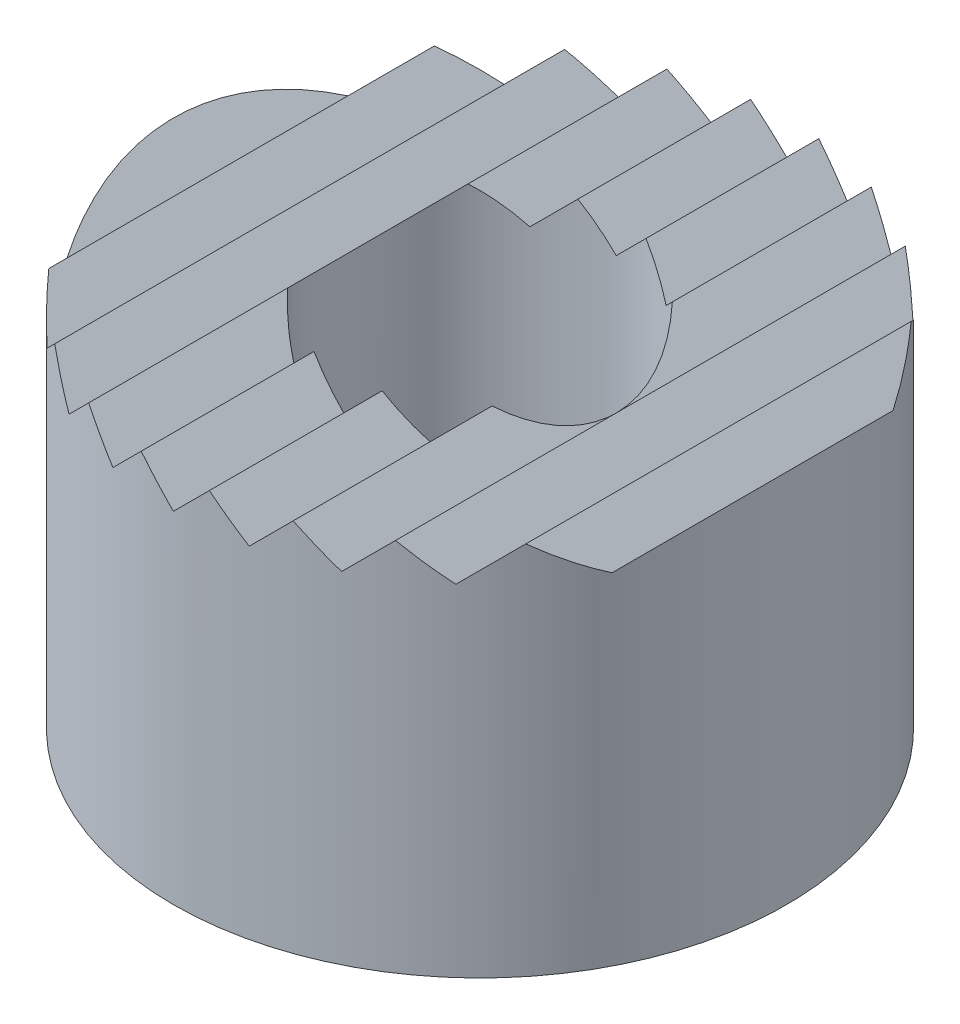
ISO-10303-21;
HEADER;
FILE_DESCRIPTION(('STEP AP214'),'2;1');
FILE_NAME('part.step','',(''),(''),'','','');
FILE_SCHEMA(('AUTOMOTIVE_DESIGN { 1 0 10303 214 1 1 1 1 }'));
ENDSEC;
DATA;
#1=APPLICATION_CONTEXT('core data for automotive mechanical design processes');
#2=APPLICATION_PROTOCOL_DEFINITION('international standard','automotive_design',2000,#1);
#3=PRODUCT_CONTEXT('',#1,'mechanical');
#4=PRODUCT('Part','Part','',(#3));
#5=PRODUCT_RELATED_PRODUCT_CATEGORY('part','',(#4));
#6=PRODUCT_DEFINITION_FORMATION('','',#4);
#7=PRODUCT_DEFINITION_CONTEXT('part definition',#1,'design');
#8=PRODUCT_DEFINITION('design','',#6,#7);
#9=PRODUCT_DEFINITION_SHAPE('','',#8);
#10=(LENGTH_UNIT() NAMED_UNIT(*) SI_UNIT(.MILLI.,.METRE.));
#11=(NAMED_UNIT(*) PLANE_ANGLE_UNIT() SI_UNIT($,.RADIAN.));
#12=(NAMED_UNIT(*) SI_UNIT($,.STERADIAN.) SOLID_ANGLE_UNIT());
#13=UNCERTAINTY_MEASURE_WITH_UNIT(LENGTH_MEASURE(1.E-05),#10,'distance_accuracy_value','');
#14=(GEOMETRIC_REPRESENTATION_CONTEXT(3) GLOBAL_UNCERTAINTY_ASSIGNED_CONTEXT((#13)) GLOBAL_UNIT_ASSIGNED_CONTEXT((#10,
#11,#12)) REPRESENTATION_CONTEXT('',''));
#15=CARTESIAN_POINT('',(0.,0.,0.));
#16=DIRECTION('',(0.,0.,1.));
#17=DIRECTION('',(1.,0.,0.));
#18=AXIS2_PLACEMENT_3D('',#15,#16,#17);
#19=CARTESIAN_POINT('',(0.,4.4,0.));
#20=DIRECTION('',(0.,-1.,0.));
#21=DIRECTION('',(0.,0.,-1.));
#22=AXIS2_PLACEMENT_3D('',#19,#20,#21);
#23=CYLINDRICAL_SURFACE('',#22,3.6);
#24=CARTESIAN_POINT('',(0.,0.,0.));
#25=DIRECTION('',(0.,1.,0.));
#26=DIRECTION('',(0.,0.,1.));
#27=AXIS2_PLACEMENT_3D('',#24,#25,#26);
#28=CIRCLE('',#27,3.6);
#29=CARTESIAN_POINT('',(0.,0.,3.6));
#30=VERTEX_POINT('',#29);
#31=EDGE_CURVE('E505',#30,#30,#28,.T.);
#32=ORIENTED_EDGE('',*,*,#31,.T.);
#33=EDGE_LOOP('',(#32));
#34=FACE_BOUND('',#33,.T.);
#35=CARTESIAN_POINT('',(0.,7.19999999999993,0.));
#36=DIRECTION('',(0.707106781186539,0.707106781186556,0.));
#37=DIRECTION('',(0.707106781186556,-0.707106781186539,0.));
#38=AXIS2_PLACEMENT_3D('',#35,#36,#37);
#39=ELLIPSE('',#38,5.09116882454308,3.6);
#40=CARTESIAN_POINT('',(3.20000000000001,4.,-1.64924225024705));
#41=VERTEX_POINT('',#40);
#42=CARTESIAN_POINT('',(2.8,4.4,-2.26274169979695));
#43=VERTEX_POINT('',#42);
#44=EDGE_CURVE('E309',#41,#43,#39,.T.);
#45=ORIENTED_EDGE('',*,*,#44,.F.);
#46=CARTESIAN_POINT('',(0.,0.799999999999908,0.));
#47=DIRECTION('',(-0.707106781186557,0.707106781186538,0.));
#48=DIRECTION('',(-0.707106781186538,-0.707106781186557,0.));
#49=AXIS2_PLACEMENT_3D('',#46,#47,#48);
#50=ELLIPSE('',#49,5.09116882454321,3.6);
#51=CARTESIAN_POINT('',(3.20000000000001,4.,1.64924225024705));
#52=VERTEX_POINT('',#51);
#53=EDGE_CURVE('E598',#52,#41,#50,.T.);
#54=ORIENTED_EDGE('',*,*,#53,.F.);
#55=CARTESIAN_POINT('',(2.8,4.4,2.26274169979695));
#56=VERTEX_POINT('',#55);
#57=EDGE_CURVE('E600',#56,#52,#39,.T.);
#58=ORIENTED_EDGE('',*,*,#57,.F.);
#59=CARTESIAN_POINT('',(0.,1.59999999999993,0.));
#60=DIRECTION('',(-0.707106781186557,0.707106781186538,0.));
#61=DIRECTION('',(-0.707106781186538,-0.707106781186557,0.));
#62=AXIS2_PLACEMENT_3D('',#59,#60,#61);
#63=ELLIPSE('',#62,5.09116882454321,3.6);
#64=CARTESIAN_POINT('',(2.40000000000001,4.,2.68328157299974));
#65=VERTEX_POINT('',#64);
#66=EDGE_CURVE('E482',#65,#56,#63,.T.);
#67=ORIENTED_EDGE('',*,*,#66,.F.);
#68=CARTESIAN_POINT('',(0.,6.39999999999995,0.));
#69=DIRECTION('',(0.707106781186539,0.707106781186556,0.));
#70=DIRECTION('',(0.707106781186556,-0.707106781186539,0.));
#71=AXIS2_PLACEMENT_3D('',#68,#69,#70);
#72=ELLIPSE('',#71,5.09116882454308,3.6);
#73=CARTESIAN_POINT('',(2.,4.4,2.99332590941915));
#74=VERTEX_POINT('',#73);
#75=EDGE_CURVE('E480',#74,#65,#72,.T.);
#76=ORIENTED_EDGE('',*,*,#75,.F.);
#77=CARTESIAN_POINT('',(0.,2.39999999999995,0.));
#78=DIRECTION('',(-0.707106781186557,0.707106781186538,0.));
#79=DIRECTION('',(-0.707106781186538,-0.707106781186557,0.));
#80=AXIS2_PLACEMENT_3D('',#77,#78,#79);
#81=ELLIPSE('',#80,5.09116882454321,3.6);
#82=CARTESIAN_POINT('',(1.60000000000001,4.,3.22490309931942));
#83=VERTEX_POINT('',#82);
#84=EDGE_CURVE('E590',#83,#74,#81,.T.);
#85=ORIENTED_EDGE('',*,*,#84,.F.);
#86=CARTESIAN_POINT('',(0.,5.59999999999997,0.));
#87=DIRECTION('',(0.707106781186539,0.707106781186556,0.));
#88=DIRECTION('',(0.707106781186556,-0.707106781186539,0.));
#89=AXIS2_PLACEMENT_3D('',#86,#87,#88);
#90=ELLIPSE('',#89,5.09116882454308,3.6);
#91=CARTESIAN_POINT('',(1.2,4.4,3.39411254969543));
#92=VERTEX_POINT('',#91);
#93=EDGE_CURVE('E584',#92,#83,#90,.T.);
#94=ORIENTED_EDGE('',*,*,#93,.F.);
#95=CARTESIAN_POINT('',(0.,3.19999999999997,0.));
#96=DIRECTION('',(-0.707106781186557,0.707106781186538,0.));
#97=DIRECTION('',(-0.707106781186538,-0.707106781186557,0.));
#98=AXIS2_PLACEMENT_3D('',#95,#96,#97);
#99=ELLIPSE('',#98,5.09116882454321,3.6);
#100=CARTESIAN_POINT('',(0.800000000000009,4.,3.50998575495685));
#101=VERTEX_POINT('',#100);
#102=EDGE_CURVE('E520',#101,#92,#99,.T.);
#103=ORIENTED_EDGE('',*,*,#102,.F.);
#104=CARTESIAN_POINT('',(0.,4.79999999999999,0.));
#105=DIRECTION('',(0.707106781186539,0.707106781186556,0.));
#106=DIRECTION('',(0.707106781186556,-0.707106781186539,0.));
#107=AXIS2_PLACEMENT_3D('',#104,#105,#106);
#108=ELLIPSE('',#107,5.09116882454308,3.6);
#109=CARTESIAN_POINT('',(0.399999999999999,4.4,3.57770876399966));
#110=VERTEX_POINT('',#109);
#111=EDGE_CURVE('E518',#110,#101,#108,.T.);
#112=ORIENTED_EDGE('',*,*,#111,.F.);
#113=CARTESIAN_POINT('',(0.,3.99999999999999,0.));
#114=DIRECTION('',(-0.707106781186557,0.707106781186538,0.));
#115=DIRECTION('',(-0.707106781186538,-0.707106781186557,0.));
#116=AXIS2_PLACEMENT_3D('',#113,#114,#115);
#117=ELLIPSE('',#116,5.09116882454321,3.6);
#118=CARTESIAN_POINT('',(0.,4.,3.6));
#119=VERTEX_POINT('',#118);
#120=EDGE_CURVE('E565',#119,#110,#117,.T.);
#121=ORIENTED_EDGE('',*,*,#120,.F.);
#122=CARTESIAN_POINT('',(0.,4.00000000000001,0.));
#123=DIRECTION('',(0.707106781186539,0.707106781186556,0.));
#124=DIRECTION('',(0.707106781186556,-0.707106781186539,0.));
#125=AXIS2_PLACEMENT_3D('',#122,#123,#124);
#126=ELLIPSE('',#125,5.09116882454308,3.6);
#127=CARTESIAN_POINT('',(-0.400000000000001,4.4,3.57770876399966));
#128=VERTEX_POINT('',#127);
#129=EDGE_CURVE('E573',#128,#119,#126,.T.);
#130=ORIENTED_EDGE('',*,*,#129,.F.);
#131=CARTESIAN_POINT('',(0.,4.80000000000001,0.));
#132=DIRECTION('',(-0.707106781186557,0.707106781186538,0.));
#133=DIRECTION('',(-0.707106781186538,-0.707106781186557,0.));
#134=AXIS2_PLACEMENT_3D('',#131,#132,#133);
#135=ELLIPSE('',#134,5.09116882454321,3.6);
#136=CARTESIAN_POINT('',(-0.79999999999999,4.,3.50998575495685));
#137=VERTEX_POINT('',#136);
#138=EDGE_CURVE('E514',#137,#128,#135,.T.);
#139=ORIENTED_EDGE('',*,*,#138,.F.);
#140=CARTESIAN_POINT('',(0.,3.20000000000003,0.));
#141=DIRECTION('',(0.707106781186539,0.707106781186556,0.));
#142=DIRECTION('',(0.707106781186556,-0.707106781186539,0.));
#143=AXIS2_PLACEMENT_3D('',#140,#141,#142);
#144=ELLIPSE('',#143,5.09116882454308,3.6);
#145=CARTESIAN_POINT('',(-1.2,4.4,3.39411254969543));
#146=VERTEX_POINT('',#145);
#147=EDGE_CURVE('E512',#146,#137,#144,.T.);
#148=ORIENTED_EDGE('',*,*,#147,.F.);
#149=CARTESIAN_POINT('',(0.,5.60000000000003,0.));
#150=DIRECTION('',(-0.707106781186557,0.707106781186538,0.));
#151=DIRECTION('',(-0.707106781186538,-0.707106781186557,0.));
#152=AXIS2_PLACEMENT_3D('',#149,#150,#151);
#153=ELLIPSE('',#152,5.09116882454321,3.6);
#154=CARTESIAN_POINT('',(-1.59999999999999,4.,3.22490309931943));
#155=VERTEX_POINT('',#154);
#156=EDGE_CURVE('E525',#155,#146,#153,.T.);
#157=ORIENTED_EDGE('',*,*,#156,.F.);
#158=CARTESIAN_POINT('',(0.,2.40000000000005,0.));
#159=DIRECTION('',(0.707106781186539,0.707106781186556,0.));
#160=DIRECTION('',(0.707106781186556,-0.707106781186539,0.));
#161=AXIS2_PLACEMENT_3D('',#158,#159,#160);
#162=ELLIPSE('',#161,5.09116882454308,3.6);
#163=CARTESIAN_POINT('',(-2.,4.4,2.99332590941915));
#164=VERTEX_POINT('',#163);
#165=EDGE_CURVE('E560',#164,#155,#162,.T.);
#166=ORIENTED_EDGE('',*,*,#165,.F.);
#167=CARTESIAN_POINT('',(0.,6.40000000000005,0.));
#168=DIRECTION('',(-0.707106781186557,0.707106781186538,0.));
#169=DIRECTION('',(-0.707106781186538,-0.707106781186557,0.));
#170=AXIS2_PLACEMENT_3D('',#167,#168,#169);
#171=ELLIPSE('',#170,5.09116882454321,3.6);
#172=CARTESIAN_POINT('',(-2.39999999999999,4.,2.68328157299976));
#173=VERTEX_POINT('',#172);
#174=EDGE_CURVE('E294',#173,#164,#171,.T.);
#175=ORIENTED_EDGE('',*,*,#174,.F.);
#176=CARTESIAN_POINT('',(0.,1.60000000000007,0.));
#177=DIRECTION('',(0.707106781186539,0.707106781186556,0.));
#178=DIRECTION('',(0.707106781186556,-0.707106781186539,0.));
#179=AXIS2_PLACEMENT_3D('',#176,#177,#178);
#180=ELLIPSE('',#179,5.09116882454308,3.6);
#181=CARTESIAN_POINT('',(-2.8,4.4,2.26274169979695));
#182=VERTEX_POINT('',#181);
#183=EDGE_CURVE('E12',#182,#173,#180,.T.);
#184=ORIENTED_EDGE('',*,*,#183,.F.);
#185=CARTESIAN_POINT('',(0.,7.20000000000007,0.));
#186=DIRECTION('',(-0.707106781186557,0.707106781186538,0.));
#187=DIRECTION('',(-0.707106781186538,-0.707106781186557,0.));
#188=AXIS2_PLACEMENT_3D('',#185,#186,#187);
#189=ELLIPSE('',#188,5.09116882454321,3.6);
#190=CARTESIAN_POINT('',(-3.19999999999999,4.,1.64924225024708));
#191=VERTEX_POINT('',#190);
#192=EDGE_CURVE('E460',#191,#182,#189,.T.);
#193=ORIENTED_EDGE('',*,*,#192,.F.);
#194=CARTESIAN_POINT('',(0.,0.80000000000009,0.));
#195=DIRECTION('',(0.707106781186539,0.707106781186556,0.));
#196=DIRECTION('',(0.707106781186556,-0.707106781186539,0.));
#197=AXIS2_PLACEMENT_3D('',#194,#195,#196);
#198=ELLIPSE('',#197,5.09116882454308,3.6);
#199=CARTESIAN_POINT('',(-3.19999999999999,4.,-1.64924225024708));
#200=VERTEX_POINT('',#199);
#201=EDGE_CURVE('E471',#200,#191,#198,.T.);
#202=ORIENTED_EDGE('',*,*,#201,.F.);
#203=CARTESIAN_POINT('',(-2.8,4.4,-2.26274169979695));
#204=VERTEX_POINT('',#203);
#205=EDGE_CURVE('E457',#204,#200,#189,.T.);
#206=ORIENTED_EDGE('',*,*,#205,.F.);
#207=CARTESIAN_POINT('',(-2.39999999999999,4.,-2.68328157299976));
#208=VERTEX_POINT('',#207);
#209=EDGE_CURVE('E289',#208,#204,#180,.T.);
#210=ORIENTED_EDGE('',*,*,#209,.F.);
#211=CARTESIAN_POINT('',(-2.,4.4,-2.99332590941915));
#212=VERTEX_POINT('',#211);
#213=EDGE_CURVE('E478',#212,#208,#171,.T.);
#214=ORIENTED_EDGE('',*,*,#213,.F.);
#215=CARTESIAN_POINT('',(-1.59999999999999,4.,-3.22490309931942));
#216=VERTEX_POINT('',#215);
#217=EDGE_CURVE('E301',#216,#212,#162,.T.);
#218=ORIENTED_EDGE('',*,*,#217,.F.);
#219=CARTESIAN_POINT('',(-1.2,4.4,-3.39411254969543));
#220=VERTEX_POINT('',#219);
#221=EDGE_CURVE('E554',#220,#216,#153,.T.);
#222=ORIENTED_EDGE('',*,*,#221,.F.);
#223=CARTESIAN_POINT('',(-0.79999999999999,4.,-3.50998575495685));
#224=VERTEX_POINT('',#223);
#225=EDGE_CURVE('E511',#224,#220,#144,.T.);
#226=ORIENTED_EDGE('',*,*,#225,.F.);
#227=CARTESIAN_POINT('',(-0.400000000000001,4.4,-3.57770876399966));
#228=VERTEX_POINT('',#227);
#229=EDGE_CURVE('E515',#228,#224,#135,.T.);
#230=ORIENTED_EDGE('',*,*,#229,.F.);
#231=CARTESIAN_POINT('',(0.,4.,-3.6));
#232=VERTEX_POINT('',#231);
#233=EDGE_CURVE('E572',#232,#228,#126,.T.);
#234=ORIENTED_EDGE('',*,*,#233,.F.);
#235=CARTESIAN_POINT('',(0.399999999999999,4.4,-3.57770876399966));
#236=VERTEX_POINT('',#235);
#237=EDGE_CURVE('E566',#236,#232,#117,.T.);
#238=ORIENTED_EDGE('',*,*,#237,.F.);
#239=CARTESIAN_POINT('',(0.800000000000009,4.,-3.50998575495685));
#240=VERTEX_POINT('',#239);
#241=EDGE_CURVE('E517',#240,#236,#108,.T.);
#242=ORIENTED_EDGE('',*,*,#241,.F.);
#243=CARTESIAN_POINT('',(1.2,4.4,-3.39411254969543));
#244=VERTEX_POINT('',#243);
#245=EDGE_CURVE('E464',#244,#240,#99,.T.);
#246=ORIENTED_EDGE('',*,*,#245,.F.);
#247=CARTESIAN_POINT('',(1.60000000000001,4.,-3.22490309931942));
#248=VERTEX_POINT('',#247);
#249=EDGE_CURVE('E583',#248,#244,#90,.T.);
#250=ORIENTED_EDGE('',*,*,#249,.F.);
#251=CARTESIAN_POINT('',(2.,4.4,-2.99332590941915));
#252=VERTEX_POINT('',#251);
#253=EDGE_CURVE('E591',#252,#248,#81,.T.);
#254=ORIENTED_EDGE('',*,*,#253,.F.);
#255=CARTESIAN_POINT('',(2.40000000000001,4.,-2.68328157299974));
#256=VERTEX_POINT('',#255);
#257=EDGE_CURVE('E484',#256,#252,#72,.T.);
#258=ORIENTED_EDGE('',*,*,#257,.F.);
#259=EDGE_CURVE('E487',#43,#256,#63,.T.);
#260=ORIENTED_EDGE('',*,*,#259,.F.);
#261=EDGE_LOOP('',(#45,#54,#58,#67,#76,#85,#94,#103,#112,#121,#130,#139,#148,#157,#166,#175,
#184,#193,#202,#206,#210,#214,#218,#222,#226,#230,#234,#238,#242,#246,#250,#254,#258,#260));
#262=FACE_BOUND('',#261,.T.);
#263=ADVANCED_FACE('F286',(#34,#262),#23,.T.);
#264=CARTESIAN_POINT('',(0.,4.4,0.));
#265=DIRECTION('',(0.,-1.,0.));
#266=DIRECTION('',(0.,0.,-1.));
#267=AXIS2_PLACEMENT_3D('',#264,#265,#266);
#268=CYLINDRICAL_SURFACE('',#267,1.6);
#269=CARTESIAN_POINT('',(0.,0.,0.));
#270=DIRECTION('',(0.,1.,0.));
#271=DIRECTION('',(0.,0.,1.));
#272=AXIS2_PLACEMENT_3D('',#269,#270,#271);
#273=CIRCLE('',#272,1.6);
#274=CARTESIAN_POINT('',(0.,0.,1.6));
#275=VERTEX_POINT('',#274);
#276=EDGE_CURVE('E508',#275,#275,#273,.T.);
#277=ORIENTED_EDGE('',*,*,#276,.F.);
#278=EDGE_LOOP('',(#277));
#279=FACE_BOUND('',#278,.T.);
#280=CARTESIAN_POINT('',(0.,5.59999999999997,0.));
#281=DIRECTION('',(0.707106781186539,0.707106781186556,0.));
#282=DIRECTION('',(0.707106781186556,-0.707106781186539,0.));
#283=AXIS2_PLACEMENT_3D('',#280,#281,#282);
#284=ELLIPSE('',#283,2.26274169979693,1.6);
#285=CARTESIAN_POINT('',(1.2,4.4,1.05830052442584));
#286=VERTEX_POINT('',#285);
#287=CARTESIAN_POINT('',(1.6,3.99999999999999,0.));
#288=VERTEX_POINT('',#287);
#289=EDGE_CURVE('E587',#286,#288,#284,.T.);
#290=ORIENTED_EDGE('',*,*,#289,.T.);
#291=CARTESIAN_POINT('',(1.2,4.4,-1.05830052442584));
#292=VERTEX_POINT('',#291);
#293=EDGE_CURVE('E586',#288,#292,#284,.T.);
#294=ORIENTED_EDGE('',*,*,#293,.T.);
#295=CARTESIAN_POINT('',(0.,3.19999999999997,0.));
#296=DIRECTION('',(-0.707106781186557,0.707106781186538,0.));
#297=DIRECTION('',(-0.707106781186538,-0.707106781186557,0.));
#298=AXIS2_PLACEMENT_3D('',#295,#296,#297);
#299=ELLIPSE('',#298,2.26274169979698,1.6);
#300=CARTESIAN_POINT('',(0.800000000000009,4.,-1.3856406460551));
#301=VERTEX_POINT('',#300);
#302=EDGE_CURVE('E502',#292,#301,#299,.T.);
#303=ORIENTED_EDGE('',*,*,#302,.T.);
#304=CARTESIAN_POINT('',(0.,4.79999999999999,0.));
#305=DIRECTION('',(0.707106781186539,0.707106781186556,0.));
#306=DIRECTION('',(0.707106781186556,-0.707106781186539,0.));
#307=AXIS2_PLACEMENT_3D('',#304,#305,#306);
#308=ELLIPSE('',#307,2.26274169979693,1.6);
#309=CARTESIAN_POINT('',(0.399999999999999,4.4,-1.54919333848297));
#310=VERTEX_POINT('',#309);
#311=EDGE_CURVE('E498',#301,#310,#308,.T.);
#312=ORIENTED_EDGE('',*,*,#311,.T.);
#313=CARTESIAN_POINT('',(0.,3.99999999999999,0.));
#314=DIRECTION('',(-0.707106781186557,0.707106781186538,0.));
#315=DIRECTION('',(-0.707106781186538,-0.707106781186557,0.));
#316=AXIS2_PLACEMENT_3D('',#313,#314,#315);
#317=ELLIPSE('',#316,2.26274169979698,1.6);
#318=CARTESIAN_POINT('',(0.,4.,-1.6));
#319=VERTEX_POINT('',#318);
#320=EDGE_CURVE('E569',#310,#319,#317,.T.);
#321=ORIENTED_EDGE('',*,*,#320,.T.);
#322=CARTESIAN_POINT('',(0.,4.00000000000001,0.));
#323=DIRECTION('',(0.707106781186539,0.707106781186556,0.));
#324=DIRECTION('',(0.707106781186556,-0.707106781186539,0.));
#325=AXIS2_PLACEMENT_3D('',#322,#323,#324);
#326=ELLIPSE('',#325,2.26274169979693,1.6);
#327=CARTESIAN_POINT('',(-0.400000000000001,4.4,-1.54919333848297));
#328=VERTEX_POINT('',#327);
#329=EDGE_CURVE('E575',#319,#328,#326,.T.);
#330=ORIENTED_EDGE('',*,*,#329,.T.);
#331=CARTESIAN_POINT('',(0.,4.80000000000001,0.));
#332=DIRECTION('',(-0.707106781186557,0.707106781186538,0.));
#333=DIRECTION('',(-0.707106781186538,-0.707106781186557,0.));
#334=AXIS2_PLACEMENT_3D('',#331,#332,#333);
#335=ELLIPSE('',#334,2.26274169979698,1.6);
#336=CARTESIAN_POINT('',(-0.79999999999999,4.,-1.38564064605511));
#337=VERTEX_POINT('',#336);
#338=EDGE_CURVE('E494',#328,#337,#335,.T.);
#339=ORIENTED_EDGE('',*,*,#338,.T.);
#340=CARTESIAN_POINT('',(0.,3.20000000000003,0.));
#341=DIRECTION('',(0.707106781186539,0.707106781186556,0.));
#342=DIRECTION('',(0.707106781186556,-0.707106781186539,0.));
#343=AXIS2_PLACEMENT_3D('',#340,#341,#342);
#344=ELLIPSE('',#343,2.26274169979693,1.6);
#345=CARTESIAN_POINT('',(-1.2,4.4,-1.05830052442584));
#346=VERTEX_POINT('',#345);
#347=EDGE_CURVE('E490',#337,#346,#344,.T.);
#348=ORIENTED_EDGE('',*,*,#347,.T.);
#349=CARTESIAN_POINT('',(0.,5.60000000000003,0.));
#350=DIRECTION('',(-0.707106781186557,0.707106781186538,0.));
#351=DIRECTION('',(-0.707106781186538,-0.707106781186557,0.));
#352=AXIS2_PLACEMENT_3D('',#349,#350,#351);
#353=ELLIPSE('',#352,2.26274169979698,1.6);
#354=CARTESIAN_POINT('',(-1.6,3.99999999999999,0.));
#355=VERTEX_POINT('',#354);
#356=EDGE_CURVE('E557',#346,#355,#353,.T.);
#357=ORIENTED_EDGE('',*,*,#356,.T.);
#358=CARTESIAN_POINT('',(-1.2,4.4,1.05830052442584));
#359=VERTEX_POINT('',#358);
#360=EDGE_CURVE('E556',#355,#359,#353,.T.);
#361=ORIENTED_EDGE('',*,*,#360,.T.);
#362=CARTESIAN_POINT('',(-0.79999999999999,4.,1.38564064605511));
#363=VERTEX_POINT('',#362);
#364=EDGE_CURVE('E489',#359,#363,#344,.T.);
#365=ORIENTED_EDGE('',*,*,#364,.T.);
#366=CARTESIAN_POINT('',(-0.400000000000001,4.4,1.54919333848297));
#367=VERTEX_POINT('',#366);
#368=EDGE_CURVE('E493',#363,#367,#335,.T.);
#369=ORIENTED_EDGE('',*,*,#368,.T.);
#370=CARTESIAN_POINT('',(0.,4.,1.6));
#371=VERTEX_POINT('',#370);
#372=EDGE_CURVE('E576',#367,#371,#326,.T.);
#373=ORIENTED_EDGE('',*,*,#372,.T.);
#374=CARTESIAN_POINT('',(0.399999999999999,4.4,1.54919333848297));
#375=VERTEX_POINT('',#374);
#376=EDGE_CURVE('E568',#371,#375,#317,.T.);
#377=ORIENTED_EDGE('',*,*,#376,.T.);
#378=CARTESIAN_POINT('',(0.800000000000009,4.,1.3856406460551));
#379=VERTEX_POINT('',#378);
#380=EDGE_CURVE('E497',#375,#379,#308,.T.);
#381=ORIENTED_EDGE('',*,*,#380,.T.);
#382=EDGE_CURVE('E501',#379,#286,#299,.T.);
#383=ORIENTED_EDGE('',*,*,#382,.T.);
#384=EDGE_LOOP('',(#290,#294,#303,#312,#321,#330,#339,#348,#357,#361,#365,#369,#373,#377,#381,#383));
#385=FACE_BOUND('',#384,.T.);
#386=ADVANCED_FACE('F636',(#279,#385),#268,.F.);
#387=CARTESIAN_POINT('',(0.,0.,0.));
#388=DIRECTION('',(0.,1.,0.));
#389=DIRECTION('',(0.,0.,1.));
#390=AXIS2_PLACEMENT_3D('',#387,#388,#389);
#391=PLANE('',#390);
#392=ORIENTED_EDGE('',*,*,#31,.F.);
#393=EDGE_LOOP('',(#392));
#394=FACE_BOUND('',#393,.T.);
#395=ORIENTED_EDGE('',*,*,#276,.T.);
#396=EDGE_LOOP('',(#395));
#397=FACE_BOUND('',#396,.T.);
#398=ADVANCED_FACE('F728',(#394,#397),#391,.F.);
#399=CARTESIAN_POINT('',(0.800000000000009,4.,10.));
#400=DIRECTION('',(-0.707106781186557,0.707106781186538,0.));
#401=DIRECTION('',(-0.707106781186538,-0.707106781186557,0.));
#402=AXIS2_PLACEMENT_3D('',#399,#400,#401);
#403=PLANE('',#402);
#404=ORIENTED_EDGE('',*,*,#245,.T.);
#405=DIRECTION('',(0.,0.,-1.));
#406=VECTOR('',#405,1.);
#407=CARTESIAN_POINT('',(0.800000000000009,4.,10.));
#408=LINE('',#407,#406);
#409=EDGE_CURVE('E537',#301,#240,#408,.T.);
#410=ORIENTED_EDGE('',*,*,#409,.F.);
#411=ORIENTED_EDGE('',*,*,#302,.F.);
#412=DIRECTION('',(0.,0.,-1.));
#413=VECTOR('',#412,1.);
#414=CARTESIAN_POINT('',(1.2,4.4,10.));
#415=LINE('',#414,#413);
#416=EDGE_CURVE('E530',#292,#244,#415,.T.);
#417=ORIENTED_EDGE('',*,*,#416,.T.);
#418=EDGE_LOOP('',(#404,#410,#411,#417));
#419=FACE_BOUND('',#418,.T.);
#420=ADVANCED_FACE('F711',(#419),#403,.T.);
#421=CARTESIAN_POINT('',(0.399999999999999,4.4,10.));
#422=DIRECTION('',(0.707106781186539,0.707106781186556,0.));
#423=DIRECTION('',(-0.707106781186556,0.707106781186539,0.));
#424=AXIS2_PLACEMENT_3D('',#421,#422,#423);
#425=PLANE('',#424);
#426=ORIENTED_EDGE('',*,*,#241,.T.);
#427=DIRECTION('',(0.,0.,-1.));
#428=VECTOR('',#427,1.);
#429=CARTESIAN_POINT('',(0.399999999999999,4.4,10.));
#430=LINE('',#429,#428);
#431=EDGE_CURVE('E534',#310,#236,#430,.T.);
#432=ORIENTED_EDGE('',*,*,#431,.F.);
#433=ORIENTED_EDGE('',*,*,#311,.F.);
#434=ORIENTED_EDGE('',*,*,#409,.T.);
#435=EDGE_LOOP('',(#426,#432,#433,#434));
#436=FACE_BOUND('',#435,.T.);
#437=ADVANCED_FACE('F706',(#436),#425,.T.);
#438=ORIENTED_EDGE('',*,*,#111,.T.);
#439=EDGE_CURVE('E540',#101,#379,#408,.T.);
#440=ORIENTED_EDGE('',*,*,#439,.T.);
#441=ORIENTED_EDGE('',*,*,#380,.F.);
#442=EDGE_CURVE('E536',#110,#375,#430,.T.);
#443=ORIENTED_EDGE('',*,*,#442,.F.);
#444=EDGE_LOOP('',(#438,#440,#441,#443));
#445=FACE_BOUND('',#444,.T.);
#446=ADVANCED_FACE('F646',(#445),#425,.T.);
#447=ORIENTED_EDGE('',*,*,#102,.T.);
#448=EDGE_CURVE('E533',#92,#286,#415,.T.);
#449=ORIENTED_EDGE('',*,*,#448,.T.);
#450=ORIENTED_EDGE('',*,*,#382,.F.);
#451=ORIENTED_EDGE('',*,*,#439,.F.);
#452=EDGE_LOOP('',(#447,#449,#450,#451));
#453=FACE_BOUND('',#452,.T.);
#454=ADVANCED_FACE('F644',(#453),#403,.T.);
#455=CARTESIAN_POINT('',(-0.79999999999999,4.,10.));
#456=DIRECTION('',(-0.707106781186557,0.707106781186538,0.));
#457=DIRECTION('',(-0.707106781186538,-0.707106781186557,0.));
#458=AXIS2_PLACEMENT_3D('',#455,#456,#457);
#459=PLANE('',#458);
#460=ORIENTED_EDGE('',*,*,#229,.T.);
#461=DIRECTION('',(0.,0.,-1.));
#462=VECTOR('',#461,1.);
#463=CARTESIAN_POINT('',(-0.79999999999999,4.,10.));
#464=LINE('',#463,#462);
#465=EDGE_CURVE('E548',#337,#224,#464,.T.);
#466=ORIENTED_EDGE('',*,*,#465,.F.);
#467=ORIENTED_EDGE('',*,*,#338,.F.);
#468=DIRECTION('',(0.,0.,-1.));
#469=VECTOR('',#468,1.);
#470=CARTESIAN_POINT('',(-0.400000000000001,4.4,10.));
#471=LINE('',#470,#469);
#472=EDGE_CURVE('E541',#328,#228,#471,.T.);
#473=ORIENTED_EDGE('',*,*,#472,.T.);
#474=EDGE_LOOP('',(#460,#466,#467,#473));
#475=FACE_BOUND('',#474,.T.);
#476=ADVANCED_FACE('F694',(#475),#459,.T.);
#477=CARTESIAN_POINT('',(-1.2,4.4,10.));
#478=DIRECTION('',(0.707106781186539,0.707106781186556,0.));
#479=DIRECTION('',(-0.707106781186556,0.707106781186539,0.));
#480=AXIS2_PLACEMENT_3D('',#477,#478,#479);
#481=PLANE('',#480);
#482=ORIENTED_EDGE('',*,*,#225,.T.);
#483=DIRECTION('',(0.,0.,-1.));
#484=VECTOR('',#483,1.);
#485=CARTESIAN_POINT('',(-1.2,4.4,10.));
#486=LINE('',#485,#484);
#487=EDGE_CURVE('E545',#346,#220,#486,.T.);
#488=ORIENTED_EDGE('',*,*,#487,.F.);
#489=ORIENTED_EDGE('',*,*,#347,.F.);
#490=ORIENTED_EDGE('',*,*,#465,.T.);
#491=EDGE_LOOP('',(#482,#488,#489,#490));
#492=FACE_BOUND('',#491,.T.);
#493=ADVANCED_FACE('F688',(#492),#481,.T.);
#494=ORIENTED_EDGE('',*,*,#147,.T.);
#495=EDGE_CURVE('E551',#137,#363,#464,.T.);
#496=ORIENTED_EDGE('',*,*,#495,.T.);
#497=ORIENTED_EDGE('',*,*,#364,.F.);
#498=EDGE_CURVE('E547',#146,#359,#486,.T.);
#499=ORIENTED_EDGE('',*,*,#498,.F.);
#500=EDGE_LOOP('',(#494,#496,#497,#499));
#501=FACE_BOUND('',#500,.T.);
#502=ADVANCED_FACE('F669',(#501),#481,.T.);
#503=ORIENTED_EDGE('',*,*,#138,.T.);
#504=EDGE_CURVE('E544',#128,#367,#471,.T.);
#505=ORIENTED_EDGE('',*,*,#504,.T.);
#506=ORIENTED_EDGE('',*,*,#368,.F.);
#507=ORIENTED_EDGE('',*,*,#495,.F.);
#508=EDGE_LOOP('',(#503,#505,#506,#507));
#509=FACE_BOUND('',#508,.T.);
#510=ADVANCED_FACE('F667',(#509),#459,.T.);
#511=CARTESIAN_POINT('',(2.,4.4,10.));
#512=DIRECTION('',(0.707106781186539,0.707106781186556,0.));
#513=DIRECTION('',(-0.707106781186556,0.707106781186539,0.));
#514=AXIS2_PLACEMENT_3D('',#511,#512,#513);
#515=PLANE('',#514);
#516=ORIENTED_EDGE('',*,*,#257,.T.);
#517=DIRECTION('',(0.,0.,-1.));
#518=VECTOR('',#517,1.);
#519=CARTESIAN_POINT('',(2.,4.4,10.));
#520=LINE('',#519,#518);
#521=EDGE_CURVE('E524',#74,#252,#520,.T.);
#522=ORIENTED_EDGE('',*,*,#521,.F.);
#523=ORIENTED_EDGE('',*,*,#75,.T.);
#524=DIRECTION('',(0.,0.,-1.));
#525=VECTOR('',#524,1.);
#526=CARTESIAN_POINT('',(2.40000000000001,4.,10.));
#527=LINE('',#526,#525);
#528=EDGE_CURVE('E527',#65,#256,#527,.T.);
#529=ORIENTED_EDGE('',*,*,#528,.T.);
#530=EDGE_LOOP('',(#516,#522,#523,#529));
#531=FACE_BOUND('',#530,.T.);
#532=ADVANCED_FACE('F618',(#531),#515,.T.);
#533=CARTESIAN_POINT('',(2.40000000000001,4.,10.));
#534=DIRECTION('',(-0.707106781186557,0.707106781186538,0.));
#535=DIRECTION('',(-0.707106781186538,-0.707106781186557,0.));
#536=AXIS2_PLACEMENT_3D('',#533,#534,#535);
#537=PLANE('',#536);
#538=ORIENTED_EDGE('',*,*,#66,.T.);
#539=DIRECTION('',(0.,0.,-1.));
#540=VECTOR('',#539,1.);
#541=CARTESIAN_POINT('',(2.8,4.4,10.));
#542=LINE('',#541,#540);
#543=EDGE_CURVE('E522',#56,#43,#542,.T.);
#544=ORIENTED_EDGE('',*,*,#543,.T.);
#545=ORIENTED_EDGE('',*,*,#259,.T.);
#546=ORIENTED_EDGE('',*,*,#528,.F.);
#547=EDGE_LOOP('',(#538,#544,#545,#546));
#548=FACE_BOUND('',#547,.T.);
#549=ADVANCED_FACE('F615',(#548),#537,.T.);
#550=CARTESIAN_POINT('',(-2.8,4.4,10.));
#551=DIRECTION('',(0.707106781186539,0.707106781186556,0.));
#552=DIRECTION('',(-0.707106781186556,0.707106781186539,0.));
#553=AXIS2_PLACEMENT_3D('',#550,#551,#552);
#554=PLANE('',#553);
#555=ORIENTED_EDGE('',*,*,#209,.T.);
#556=DIRECTION('',(0.,0.,-1.));
#557=VECTOR('',#556,1.);
#558=CARTESIAN_POINT('',(-2.8,4.4,10.));
#559=LINE('',#558,#557);
#560=EDGE_CURVE('E453',#182,#204,#559,.T.);
#561=ORIENTED_EDGE('',*,*,#560,.F.);
#562=ORIENTED_EDGE('',*,*,#183,.T.);
#563=DIRECTION('',(0.,0.,-1.));
#564=VECTOR('',#563,1.);
#565=CARTESIAN_POINT('',(-2.39999999999999,4.,10.));
#566=LINE('',#565,#564);
#567=EDGE_CURVE('E477',#173,#208,#566,.T.);
#568=ORIENTED_EDGE('',*,*,#567,.T.);
#569=EDGE_LOOP('',(#555,#561,#562,#568));
#570=FACE_BOUND('',#569,.T.);
#571=ADVANCED_FACE('F475',(#570),#554,.T.);
#572=CARTESIAN_POINT('',(-2.39999999999999,4.,10.));
#573=DIRECTION('',(-0.707106781186557,0.707106781186538,0.));
#574=DIRECTION('',(-0.707106781186538,-0.707106781186557,0.));
#575=AXIS2_PLACEMENT_3D('',#572,#573,#574);
#576=PLANE('',#575);
#577=ORIENTED_EDGE('',*,*,#174,.T.);
#578=DIRECTION('',(0.,0.,-1.));
#579=VECTOR('',#578,1.);
#580=CARTESIAN_POINT('',(-2.,4.4,10.));
#581=LINE('',#580,#579);
#582=EDGE_CURVE('E465',#164,#212,#581,.T.);
#583=ORIENTED_EDGE('',*,*,#582,.T.);
#584=ORIENTED_EDGE('',*,*,#213,.T.);
#585=ORIENTED_EDGE('',*,*,#567,.F.);
#586=EDGE_LOOP('',(#577,#583,#584,#585));
#587=FACE_BOUND('',#586,.T.);
#588=ADVANCED_FACE('F754',(#587),#576,.T.);
#589=CARTESIAN_POINT('',(-1.59999999999999,4.,10.));
#590=DIRECTION('',(-0.707106781186557,0.707106781186538,0.));
#591=DIRECTION('',(-0.707106781186538,-0.707106781186557,0.));
#592=AXIS2_PLACEMENT_3D('',#589,#590,#591);
#593=PLANE('',#592);
#594=ORIENTED_EDGE('',*,*,#156,.T.);
#595=ORIENTED_EDGE('',*,*,#498,.T.);
#596=ORIENTED_EDGE('',*,*,#360,.F.);
#597=DIRECTION('',(0.,0.,-1.));
#598=VECTOR('',#597,1.);
#599=CARTESIAN_POINT('',(-1.59999999999999,4.,10.));
#600=LINE('',#599,#598);
#601=EDGE_CURVE('E562',#155,#355,#600,.T.);
#602=ORIENTED_EDGE('',*,*,#601,.F.);
#603=EDGE_LOOP('',(#594,#595,#596,#602));
#604=FACE_BOUND('',#603,.T.);
#605=ADVANCED_FACE('F677',(#604),#593,.T.);
#606=ORIENTED_EDGE('',*,*,#221,.T.);
#607=EDGE_CURVE('E563',#355,#216,#600,.T.);
#608=ORIENTED_EDGE('',*,*,#607,.F.);
#609=ORIENTED_EDGE('',*,*,#356,.F.);
#610=ORIENTED_EDGE('',*,*,#487,.T.);
#611=EDGE_LOOP('',(#606,#608,#609,#610));
#612=FACE_BOUND('',#611,.T.);
#613=ADVANCED_FACE('F684',(#612),#593,.T.);
#614=CARTESIAN_POINT('',(-2.,4.4,10.));
#615=DIRECTION('',(0.707106781186539,0.707106781186556,0.));
#616=DIRECTION('',(-0.707106781186556,0.707106781186539,0.));
#617=AXIS2_PLACEMENT_3D('',#614,#615,#616);
#618=PLANE('',#617);
#619=ORIENTED_EDGE('',*,*,#217,.T.);
#620=ORIENTED_EDGE('',*,*,#582,.F.);
#621=ORIENTED_EDGE('',*,*,#165,.T.);
#622=ORIENTED_EDGE('',*,*,#601,.T.);
#623=ORIENTED_EDGE('',*,*,#607,.T.);
#624=EDGE_LOOP('',(#619,#620,#621,#622,#623));
#625=FACE_BOUND('',#624,.T.);
#626=ADVANCED_FACE('F680',(#625),#618,.T.);
#627=CARTESIAN_POINT('',(-0.400000000000001,4.4,10.));
#628=DIRECTION('',(0.707106781186539,0.707106781186556,0.));
#629=DIRECTION('',(-0.707106781186556,0.707106781186539,0.));
#630=AXIS2_PLACEMENT_3D('',#627,#628,#629);
#631=PLANE('',#630);
#632=ORIENTED_EDGE('',*,*,#129,.T.);
#633=DIRECTION('',(0.,0.,-1.));
#634=VECTOR('',#633,1.);
#635=CARTESIAN_POINT('',(0.,4.,10.));
#636=LINE('',#635,#634);
#637=EDGE_CURVE('E579',#119,#371,#636,.T.);
#638=ORIENTED_EDGE('',*,*,#637,.T.);
#639=ORIENTED_EDGE('',*,*,#372,.F.);
#640=ORIENTED_EDGE('',*,*,#504,.F.);
#641=EDGE_LOOP('',(#632,#638,#639,#640));
#642=FACE_BOUND('',#641,.T.);
#643=ADVANCED_FACE('F658',(#642),#631,.T.);
#644=CARTESIAN_POINT('',(0.,4.,10.));
#645=DIRECTION('',(-0.707106781186557,0.707106781186538,0.));
#646=DIRECTION('',(-0.707106781186538,-0.707106781186557,0.));
#647=AXIS2_PLACEMENT_3D('',#644,#645,#646);
#648=PLANE('',#647);
#649=ORIENTED_EDGE('',*,*,#120,.T.);
#650=ORIENTED_EDGE('',*,*,#442,.T.);
#651=ORIENTED_EDGE('',*,*,#376,.F.);
#652=ORIENTED_EDGE('',*,*,#637,.F.);
#653=EDGE_LOOP('',(#649,#650,#651,#652));
#654=FACE_BOUND('',#653,.T.);
#655=ADVANCED_FACE('F655',(#654),#648,.T.);
#656=ORIENTED_EDGE('',*,*,#237,.T.);
#657=EDGE_CURVE('E580',#319,#232,#636,.T.);
#658=ORIENTED_EDGE('',*,*,#657,.F.);
#659=ORIENTED_EDGE('',*,*,#320,.F.);
#660=ORIENTED_EDGE('',*,*,#431,.T.);
#661=EDGE_LOOP('',(#656,#658,#659,#660));
#662=FACE_BOUND('',#661,.T.);
#663=ADVANCED_FACE('F703',(#662),#648,.T.);
#664=ORIENTED_EDGE('',*,*,#233,.T.);
#665=ORIENTED_EDGE('',*,*,#472,.F.);
#666=ORIENTED_EDGE('',*,*,#329,.F.);
#667=ORIENTED_EDGE('',*,*,#657,.T.);
#668=EDGE_LOOP('',(#664,#665,#666,#667));
#669=FACE_BOUND('',#668,.T.);
#670=ADVANCED_FACE('F698',(#669),#631,.T.);
#671=CARTESIAN_POINT('',(1.2,4.4,10.));
#672=DIRECTION('',(0.707106781186539,0.707106781186556,0.));
#673=DIRECTION('',(-0.707106781186556,0.707106781186539,0.));
#674=AXIS2_PLACEMENT_3D('',#671,#672,#673);
#675=PLANE('',#674);
#676=ORIENTED_EDGE('',*,*,#249,.T.);
#677=ORIENTED_EDGE('',*,*,#416,.F.);
#678=ORIENTED_EDGE('',*,*,#293,.F.);
#679=DIRECTION('',(0.,0.,-1.));
#680=VECTOR('',#679,1.);
#681=CARTESIAN_POINT('',(1.60000000000001,4.,10.));
#682=LINE('',#681,#680);
#683=EDGE_CURVE('E594',#288,#248,#682,.T.);
#684=ORIENTED_EDGE('',*,*,#683,.T.);
#685=EDGE_LOOP('',(#676,#677,#678,#684));
#686=FACE_BOUND('',#685,.T.);
#687=ADVANCED_FACE('F713',(#686),#675,.T.);
#688=ORIENTED_EDGE('',*,*,#93,.T.);
#689=EDGE_CURVE('E593',#83,#288,#682,.T.);
#690=ORIENTED_EDGE('',*,*,#689,.T.);
#691=ORIENTED_EDGE('',*,*,#289,.F.);
#692=ORIENTED_EDGE('',*,*,#448,.F.);
#693=EDGE_LOOP('',(#688,#690,#691,#692));
#694=FACE_BOUND('',#693,.T.);
#695=ADVANCED_FACE('F631',(#694),#675,.T.);
#696=CARTESIAN_POINT('',(1.60000000000001,4.,10.));
#697=DIRECTION('',(-0.707106781186557,0.707106781186538,0.));
#698=DIRECTION('',(-0.707106781186538,-0.707106781186557,0.));
#699=AXIS2_PLACEMENT_3D('',#696,#697,#698);
#700=PLANE('',#699);
#701=ORIENTED_EDGE('',*,*,#84,.T.);
#702=ORIENTED_EDGE('',*,*,#521,.T.);
#703=ORIENTED_EDGE('',*,*,#253,.T.);
#704=ORIENTED_EDGE('',*,*,#683,.F.);
#705=ORIENTED_EDGE('',*,*,#689,.F.);
#706=EDGE_LOOP('',(#701,#702,#703,#704,#705));
#707=FACE_BOUND('',#706,.T.);
#708=ADVANCED_FACE('F627',(#707),#700,.T.);
#709=CARTESIAN_POINT('',(-3.6,4.4,10.));
#710=DIRECTION('',(0.707106781186539,0.707106781186556,0.));
#711=DIRECTION('',(-0.707106781186556,0.707106781186539,0.));
#712=AXIS2_PLACEMENT_3D('',#709,#710,#711);
#713=PLANE('',#712);
#714=ORIENTED_EDGE('',*,*,#201,.T.);
#715=DIRECTION('',(0.,0.,-1.));
#716=VECTOR('',#715,1.);
#717=CARTESIAN_POINT('',(-3.19999999999999,4.,10.));
#718=LINE('',#717,#716);
#719=EDGE_CURVE('E602',#191,#200,#718,.T.);
#720=ORIENTED_EDGE('',*,*,#719,.T.);
#721=EDGE_LOOP('',(#714,#720));
#722=FACE_BOUND('',#721,.T.);
#723=ADVANCED_FACE('F763',(#722),#713,.T.);
#724=CARTESIAN_POINT('',(-3.19999999999999,4.,10.));
#725=DIRECTION('',(-0.707106781186557,0.707106781186538,0.));
#726=DIRECTION('',(-0.707106781186538,-0.707106781186557,0.));
#727=AXIS2_PLACEMENT_3D('',#724,#725,#726);
#728=PLANE('',#727);
#729=ORIENTED_EDGE('',*,*,#192,.T.);
#730=ORIENTED_EDGE('',*,*,#560,.T.);
#731=ORIENTED_EDGE('',*,*,#205,.T.);
#732=ORIENTED_EDGE('',*,*,#719,.F.);
#733=EDGE_LOOP('',(#729,#730,#731,#732));
#734=FACE_BOUND('',#733,.T.);
#735=ADVANCED_FACE('F455',(#734),#728,.T.);
#736=CARTESIAN_POINT('',(3.20000000000001,4.,10.));
#737=DIRECTION('',(-0.707106781186557,0.707106781186538,0.));
#738=DIRECTION('',(-0.707106781186538,-0.707106781186557,0.));
#739=AXIS2_PLACEMENT_3D('',#736,#737,#738);
#740=PLANE('',#739);
#741=ORIENTED_EDGE('',*,*,#53,.T.);
#742=DIRECTION('',(0.,0.,-1.));
#743=VECTOR('',#742,1.);
#744=CARTESIAN_POINT('',(3.20000000000001,4.,10.));
#745=LINE('',#744,#743);
#746=EDGE_CURVE('E472',#52,#41,#745,.T.);
#747=ORIENTED_EDGE('',*,*,#746,.F.);
#748=EDGE_LOOP('',(#741,#747));
#749=FACE_BOUND('',#748,.T.);
#750=ADVANCED_FACE('F771',(#749),#740,.T.);
#751=CARTESIAN_POINT('',(2.8,4.4,10.));
#752=DIRECTION('',(0.707106781186539,0.707106781186556,0.));
#753=DIRECTION('',(-0.707106781186556,0.707106781186539,0.));
#754=AXIS2_PLACEMENT_3D('',#751,#752,#753);
#755=PLANE('',#754);
#756=ORIENTED_EDGE('',*,*,#44,.T.);
#757=ORIENTED_EDGE('',*,*,#543,.F.);
#758=ORIENTED_EDGE('',*,*,#57,.T.);
#759=ORIENTED_EDGE('',*,*,#746,.T.);
#760=EDGE_LOOP('',(#756,#757,#758,#759));
#761=FACE_BOUND('',#760,.T.);
#762=ADVANCED_FACE('F605',(#761),#755,.T.);
#763=CLOSED_SHELL('',(#263,#386,#398,#420,#437,#446,#454,#476,#493,#502,#510,#532,#549,#571,
#588,#605,#613,#626,#643,#655,#663,#670,#687,#695,#708,#723,#735,#750,#762));
#764=MANIFOLD_SOLID_BREP('B2',#763);
#765=ADVANCED_BREP_SHAPE_REPRESENTATION('',(#18,#764),#14);
#766=SHAPE_DEFINITION_REPRESENTATION(#9,#765);
ENDSEC;
END-ISO-10303-21;
